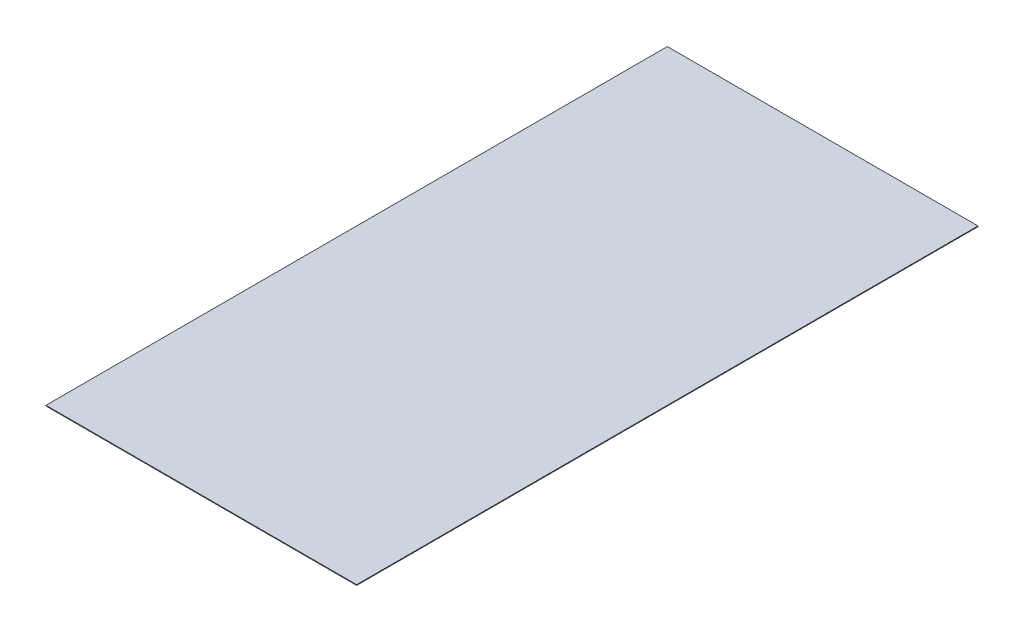
ISO-10303-21;
HEADER;
FILE_DESCRIPTION(('STEP AP214'),'2;1');
FILE_NAME('part.step','',(''),(''),'','','');
FILE_SCHEMA(('AUTOMOTIVE_DESIGN { 1 0 10303 214 1 1 1 1 }'));
ENDSEC;
DATA;
#1=APPLICATION_CONTEXT('core data for automotive mechanical design processes');
#2=APPLICATION_PROTOCOL_DEFINITION('international standard','automotive_design',2000,#1);
#3=PRODUCT_CONTEXT('',#1,'mechanical');
#4=PRODUCT('Part','Part','',(#3));
#5=PRODUCT_RELATED_PRODUCT_CATEGORY('part','',(#4));
#6=PRODUCT_DEFINITION_FORMATION('','',#4);
#7=PRODUCT_DEFINITION_CONTEXT('part definition',#1,'design');
#8=PRODUCT_DEFINITION('design','',#6,#7);
#9=PRODUCT_DEFINITION_SHAPE('','',#8);
#10=(LENGTH_UNIT() NAMED_UNIT(*) SI_UNIT(.MILLI.,.METRE.));
#11=(NAMED_UNIT(*) PLANE_ANGLE_UNIT() SI_UNIT($,.RADIAN.));
#12=(NAMED_UNIT(*) SI_UNIT($,.STERADIAN.) SOLID_ANGLE_UNIT());
#13=UNCERTAINTY_MEASURE_WITH_UNIT(LENGTH_MEASURE(1.E-05),#10,'distance_accuracy_value','');
#14=(GEOMETRIC_REPRESENTATION_CONTEXT(3) GLOBAL_UNCERTAINTY_ASSIGNED_CONTEXT((#13)) GLOBAL_UNIT_ASSIGNED_CONTEXT((#10,
#11,#12)) REPRESENTATION_CONTEXT('',''));
#15=CARTESIAN_POINT('',(0.,0.,0.));
#16=DIRECTION('',(0.,0.,1.));
#17=DIRECTION('',(1.,0.,0.));
#18=AXIS2_PLACEMENT_3D('',#15,#16,#17);
#19=CARTESIAN_POINT('',(609.6,2.7,1219.2));
#20=DIRECTION('',(-1.,0.,0.));
#21=DIRECTION('',(0.,0.,1.));
#22=AXIS2_PLACEMENT_3D('',#19,#20,#21);
#23=PLANE('',#22);
#24=DIRECTION('',(0.,0.,-1.));
#25=VECTOR('',#24,1.);
#26=CARTESIAN_POINT('',(609.6,0.,1219.2));
#27=LINE('',#26,#25);
#28=CARTESIAN_POINT('',(609.6,0.,1219.2));
#29=VERTEX_POINT('',#28);
#30=CARTESIAN_POINT('',(609.6,0.,-1219.2));
#31=VERTEX_POINT('',#30);
#32=EDGE_CURVE('E96',#29,#31,#27,.T.);
#33=ORIENTED_EDGE('',*,*,#32,.T.);
#34=DIRECTION('',(0.,-1.,0.));
#35=VECTOR('',#34,1.);
#36=CARTESIAN_POINT('',(609.6,2.7,-1219.2));
#37=LINE('',#36,#35);
#38=CARTESIAN_POINT('',(609.6,2.7,-1219.2));
#39=VERTEX_POINT('',#38);
#40=EDGE_CURVE('E11',#39,#31,#37,.T.);
#41=ORIENTED_EDGE('',*,*,#40,.F.);
#42=DIRECTION('',(0.,0.,-1.));
#43=VECTOR('',#42,1.);
#44=CARTESIAN_POINT('',(609.6,2.7,1219.2));
#45=LINE('',#44,#43);
#46=CARTESIAN_POINT('',(609.6,2.7,1219.2));
#47=VERTEX_POINT('',#46);
#48=EDGE_CURVE('E84',#47,#39,#45,.T.);
#49=ORIENTED_EDGE('',*,*,#48,.F.);
#50=DIRECTION('',(0.,-1.,0.));
#51=VECTOR('',#50,1.);
#52=CARTESIAN_POINT('',(609.6,2.7,1219.2));
#53=LINE('',#52,#51);
#54=EDGE_CURVE('E92',#47,#29,#53,.T.);
#55=ORIENTED_EDGE('',*,*,#54,.T.);
#56=EDGE_LOOP('',(#33,#41,#49,#55));
#57=FACE_BOUND('',#56,.T.);
#58=ADVANCED_FACE('F33',(#57),#23,.F.);
#59=CARTESIAN_POINT('',(-609.6,2.7,-1219.2));
#60=DIRECTION('',(0.,0.,1.));
#61=DIRECTION('',(1.,0.,0.));
#62=AXIS2_PLACEMENT_3D('',#59,#60,#61);
#63=PLANE('',#62);
#64=DIRECTION('',(-1.,0.,0.));
#65=VECTOR('',#64,1.);
#66=CARTESIAN_POINT('',(-609.6,0.,-1219.2));
#67=LINE('',#66,#65);
#68=CARTESIAN_POINT('',(-609.6,0.,-1219.2));
#69=VERTEX_POINT('',#68);
#70=EDGE_CURVE('E88',#31,#69,#67,.T.);
#71=ORIENTED_EDGE('',*,*,#70,.T.);
#72=DIRECTION('',(0.,-1.,0.));
#73=VECTOR('',#72,1.);
#74=CARTESIAN_POINT('',(-609.6,2.7,-1219.2));
#75=LINE('',#74,#73);
#76=CARTESIAN_POINT('',(-609.6,2.7,-1219.2));
#77=VERTEX_POINT('',#76);
#78=EDGE_CURVE('E41',#77,#69,#75,.T.);
#79=ORIENTED_EDGE('',*,*,#78,.F.);
#80=DIRECTION('',(-1.,0.,0.));
#81=VECTOR('',#80,1.);
#82=CARTESIAN_POINT('',(-609.6,2.7,-1219.2));
#83=LINE('',#82,#81);
#84=EDGE_CURVE('E79',#39,#77,#83,.T.);
#85=ORIENTED_EDGE('',*,*,#84,.F.);
#86=ORIENTED_EDGE('',*,*,#40,.T.);
#87=EDGE_LOOP('',(#71,#79,#85,#86));
#88=FACE_BOUND('',#87,.T.);
#89=ADVANCED_FACE('F87',(#88),#63,.F.);
#90=CARTESIAN_POINT('',(-609.6,2.7,1219.2));
#91=DIRECTION('',(1.,0.,0.));
#92=DIRECTION('',(0.,0.,-1.));
#93=AXIS2_PLACEMENT_3D('',#90,#91,#92);
#94=PLANE('',#93);
#95=DIRECTION('',(0.,0.,1.));
#96=VECTOR('',#95,1.);
#97=CARTESIAN_POINT('',(-609.6,0.,1219.2));
#98=LINE('',#97,#96);
#99=CARTESIAN_POINT('',(-609.6,0.,1219.2));
#100=VERTEX_POINT('',#99);
#101=EDGE_CURVE('E66',#69,#100,#98,.T.);
#102=ORIENTED_EDGE('',*,*,#101,.T.);
#103=DIRECTION('',(0.,-1.,0.));
#104=VECTOR('',#103,1.);
#105=CARTESIAN_POINT('',(-609.6,2.7,1219.2));
#106=LINE('',#105,#104);
#107=CARTESIAN_POINT('',(-609.6,2.7,1219.2));
#108=VERTEX_POINT('',#107);
#109=EDGE_CURVE('E89',#108,#100,#106,.T.);
#110=ORIENTED_EDGE('',*,*,#109,.F.);
#111=DIRECTION('',(0.,0.,1.));
#112=VECTOR('',#111,1.);
#113=CARTESIAN_POINT('',(-609.6,2.7,1219.2));
#114=LINE('',#113,#112);
#115=EDGE_CURVE('E82',#77,#108,#114,.T.);
#116=ORIENTED_EDGE('',*,*,#115,.F.);
#117=ORIENTED_EDGE('',*,*,#78,.T.);
#118=EDGE_LOOP('',(#102,#110,#116,#117));
#119=FACE_BOUND('',#118,.T.);
#120=ADVANCED_FACE('F90',(#119),#94,.F.);
#121=CARTESIAN_POINT('',(-609.6,2.7,1219.2));
#122=DIRECTION('',(0.,0.,-1.));
#123=DIRECTION('',(-1.,0.,0.));
#124=AXIS2_PLACEMENT_3D('',#121,#122,#123);
#125=PLANE('',#124);
#126=DIRECTION('',(1.,0.,0.));
#127=VECTOR('',#126,1.);
#128=CARTESIAN_POINT('',(-609.6,0.,1219.2));
#129=LINE('',#128,#127);
#130=EDGE_CURVE('E72',#100,#29,#129,.T.);
#131=ORIENTED_EDGE('',*,*,#130,.T.);
#132=ORIENTED_EDGE('',*,*,#54,.F.);
#133=DIRECTION('',(1.,0.,0.));
#134=VECTOR('',#133,1.);
#135=CARTESIAN_POINT('',(-609.6,2.7,1219.2));
#136=LINE('',#135,#134);
#137=EDGE_CURVE('E49',#108,#47,#136,.T.);
#138=ORIENTED_EDGE('',*,*,#137,.F.);
#139=ORIENTED_EDGE('',*,*,#109,.T.);
#140=EDGE_LOOP('',(#131,#132,#138,#139));
#141=FACE_BOUND('',#140,.T.);
#142=ADVANCED_FACE('F103',(#141),#125,.F.);
#143=CARTESIAN_POINT('',(0.,2.7,0.));
#144=DIRECTION('',(0.,-1.,0.));
#145=DIRECTION('',(0.,0.,-1.));
#146=AXIS2_PLACEMENT_3D('',#143,#144,#145);
#147=PLANE('',#146);
#148=ORIENTED_EDGE('',*,*,#48,.T.);
#149=ORIENTED_EDGE('',*,*,#84,.T.);
#150=ORIENTED_EDGE('',*,*,#115,.T.);
#151=ORIENTED_EDGE('',*,*,#137,.T.);
#152=EDGE_LOOP('',(#148,#149,#150,#151));
#153=FACE_BOUND('',#152,.T.);
#154=ADVANCED_FACE('F80',(#153),#147,.F.);
#155=CARTESIAN_POINT('',(0.,0.,0.));
#156=DIRECTION('',(0.,-1.,0.));
#157=DIRECTION('',(0.,0.,-1.));
#158=AXIS2_PLACEMENT_3D('',#155,#156,#157);
#159=PLANE('',#158);
#160=ORIENTED_EDGE('',*,*,#32,.F.);
#161=ORIENTED_EDGE('',*,*,#130,.F.);
#162=ORIENTED_EDGE('',*,*,#101,.F.);
#163=ORIENTED_EDGE('',*,*,#70,.F.);
#164=EDGE_LOOP('',(#160,#161,#162,#163));
#165=FACE_BOUND('',#164,.T.);
#166=ADVANCED_FACE('F106',(#165),#159,.T.);
#167=CLOSED_SHELL('',(#58,#89,#120,#142,#154,#166));
#168=MANIFOLD_SOLID_BREP('B2',#167);
#169=ADVANCED_BREP_SHAPE_REPRESENTATION('',(#18,#168),#14);
#170=SHAPE_DEFINITION_REPRESENTATION(#9,#169);
ENDSEC;
END-ISO-10303-21;
